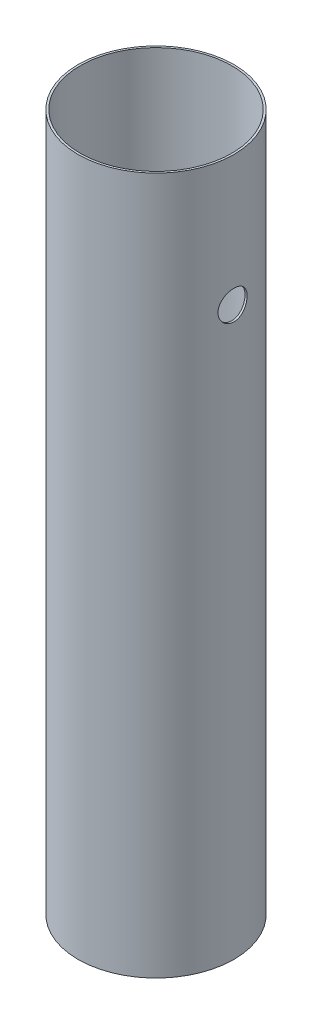
ISO-10303-21;
HEADER;
FILE_DESCRIPTION(('STEP AP214'),'2;1');
FILE_NAME('part.step','',(''),(''),'','','');
FILE_SCHEMA(('AUTOMOTIVE_DESIGN { 1 0 10303 214 1 1 1 1 }'));
ENDSEC;
DATA;
#1=APPLICATION_CONTEXT('core data for automotive mechanical design processes');
#2=APPLICATION_PROTOCOL_DEFINITION('international standard','automotive_design',2000,#1);
#3=PRODUCT_CONTEXT('',#1,'mechanical');
#4=PRODUCT('Part','Part','',(#3));
#5=PRODUCT_RELATED_PRODUCT_CATEGORY('part','',(#4));
#6=PRODUCT_DEFINITION_FORMATION('','',#4);
#7=PRODUCT_DEFINITION_CONTEXT('part definition',#1,'design');
#8=PRODUCT_DEFINITION('design','',#6,#7);
#9=PRODUCT_DEFINITION_SHAPE('','',#8);
#10=(LENGTH_UNIT() NAMED_UNIT(*) SI_UNIT(.MILLI.,.METRE.));
#11=(NAMED_UNIT(*) PLANE_ANGLE_UNIT() SI_UNIT($,.RADIAN.));
#12=(NAMED_UNIT(*) SI_UNIT($,.STERADIAN.) SOLID_ANGLE_UNIT());
#13=UNCERTAINTY_MEASURE_WITH_UNIT(LENGTH_MEASURE(1.E-05),#10,'distance_accuracy_value','');
#14=(GEOMETRIC_REPRESENTATION_CONTEXT(3) GLOBAL_UNCERTAINTY_ASSIGNED_CONTEXT((#13)) GLOBAL_UNIT_ASSIGNED_CONTEXT((#10,
#11,#12)) REPRESENTATION_CONTEXT('',''));
#15=CARTESIAN_POINT('',(0.,0.,0.));
#16=DIRECTION('',(0.,0.,1.));
#17=DIRECTION('',(1.,0.,0.));
#18=AXIS2_PLACEMENT_3D('',#15,#16,#17);
#19=CARTESIAN_POINT('',(0.,510.,0.));
#20=DIRECTION('',(0.,1.,0.));
#21=DIRECTION('',(0.,0.,1.));
#22=AXIS2_PLACEMENT_3D('',#19,#20,#21);
#23=PLANE('',#22);
#24=CARTESIAN_POINT('',(0.,510.,0.));
#25=DIRECTION('',(0.,1.,0.));
#26=DIRECTION('',(0.,0.,1.));
#27=AXIS2_PLACEMENT_3D('',#24,#25,#26);
#28=CIRCLE('',#27,57.);
#29=CARTESIAN_POINT('',(0.,510.,57.));
#30=VERTEX_POINT('',#29);
#31=EDGE_CURVE('E10',#30,#30,#28,.T.);
#32=ORIENTED_EDGE('',*,*,#31,.T.);
#33=EDGE_LOOP('',(#32));
#34=FACE_BOUND('',#33,.T.);
#35=CARTESIAN_POINT('',(0.,510.,0.));
#36=DIRECTION('',(0.,1.,0.));
#37=DIRECTION('',(0.,0.,1.));
#38=AXIS2_PLACEMENT_3D('',#35,#36,#37);
#39=CIRCLE('',#38,55.5);
#40=CARTESIAN_POINT('',(0.,510.,55.5));
#41=VERTEX_POINT('',#40);
#42=EDGE_CURVE('E62',#41,#41,#39,.T.);
#43=ORIENTED_EDGE('',*,*,#42,.F.);
#44=EDGE_LOOP('',(#43));
#45=FACE_BOUND('',#44,.T.);
#46=ADVANCED_FACE('F40',(#34,#45),#23,.T.);
#47=CARTESIAN_POINT('',(0.,0.,0.));
#48=DIRECTION('',(0.,1.,0.));
#49=DIRECTION('',(0.,0.,1.));
#50=AXIS2_PLACEMENT_3D('',#47,#48,#49);
#51=PLANE('',#50);
#52=CARTESIAN_POINT('',(0.,0.,0.));
#53=DIRECTION('',(0.,1.,0.));
#54=DIRECTION('',(0.,0.,1.));
#55=AXIS2_PLACEMENT_3D('',#52,#53,#54);
#56=CIRCLE('',#55,57.);
#57=CARTESIAN_POINT('',(0.,0.,57.));
#58=VERTEX_POINT('',#57);
#59=EDGE_CURVE('E55',#58,#58,#56,.T.);
#60=ORIENTED_EDGE('',*,*,#59,.F.);
#61=EDGE_LOOP('',(#60));
#62=FACE_BOUND('',#61,.T.);
#63=CARTESIAN_POINT('',(0.,0.,0.));
#64=DIRECTION('',(0.,1.,0.));
#65=DIRECTION('',(0.,0.,1.));
#66=AXIS2_PLACEMENT_3D('',#63,#64,#65);
#67=CIRCLE('',#66,55.5);
#68=CARTESIAN_POINT('',(0.,0.,55.5));
#69=VERTEX_POINT('',#68);
#70=EDGE_CURVE('E64',#69,#69,#67,.T.);
#71=ORIENTED_EDGE('',*,*,#70,.T.);
#72=EDGE_LOOP('',(#71));
#73=FACE_BOUND('',#72,.T.);
#74=ADVANCED_FACE('F88',(#62,#73),#51,.F.);
#75=CARTESIAN_POINT('',(0.,510.,0.));
#76=DIRECTION('',(0.,-1.,0.));
#77=DIRECTION('',(0.,0.,-1.));
#78=AXIS2_PLACEMENT_3D('',#75,#76,#77);
#79=CYLINDRICAL_SURFACE('',#78,57.);
#80=CARTESIAN_POINT('',(55.9962275515056,414.6,-10.65));
#81=CARTESIAN_POINT('',(55.9962248264401,414.303606493025,-10.65000534172));
#82=CARTESIAN_POINT('',(55.9985852715017,414.007281897164,-10.6376233888147));
#83=CARTESIAN_POINT('',(56.0079516401063,413.41668012737,-10.5882026044158));
#84=CARTESIAN_POINT('',(56.0149584054538,413.122403334216,-10.5511593048583));
#85=CARTESIAN_POINT('',(56.0334218056581,412.537892153058,-10.4526615865703));
#86=CARTESIAN_POINT('',(56.0448817409927,412.247660929092,-10.391189061291));
#87=CARTESIAN_POINT('',(56.0719147438818,411.673508328465,-10.2443130162571));
#88=CARTESIAN_POINT('',(56.0874878903964,411.389587073047,-10.1589090370958));
#89=CARTESIAN_POINT('',(56.1222786392683,410.830319468631,-9.96491503754015));
#90=CARTESIAN_POINT('',(56.1414927351434,410.554965163694,-9.85634731284519));
#91=CARTESIAN_POINT('',(56.1830247836914,410.014436025271,-9.61678197248011));
#92=CARTESIAN_POINT('',(56.2053427672397,409.749261293076,-9.48578413368787));
#93=CARTESIAN_POINT('',(56.2524446506903,409.230956376279,-9.20234175201339));
#94=CARTESIAN_POINT('',(56.2772279020502,408.97782304969,-9.04990284532547));
#95=CARTESIAN_POINT('',(56.3285806948245,408.485136021507,-8.72456958696255));
#96=CARTESIAN_POINT('',(56.3551508213267,408.24558681564,-8.55166852101495));
#97=CARTESIAN_POINT('',(56.4096306419738,407.779211287328,-8.18464126726331));
#98=CARTESIAN_POINT('',(56.4375517943655,407.552552430109,-7.99030395204357));
#99=CARTESIAN_POINT('',(56.4936771532857,407.116361181873,-7.58331246752891));
#100=CARTESIAN_POINT('',(56.5218813614878,406.906828892189,-7.37065818987174));
#101=CARTESIAN_POINT('',(56.5777924796539,406.506270753371,-6.92842489974231));
#102=CARTESIAN_POINT('',(56.6054992681262,406.315249376634,-6.69884182060156));
#103=CARTESIAN_POINT('',(56.6596274198989,405.953155198058,-6.22443471302231));
#104=CARTESIAN_POINT('',(56.6860492301467,405.78207543069,-5.97961605242516));
#105=CARTESIAN_POINT('',(56.7370797671978,405.459745562584,-5.47437068115217));
#106=CARTESIAN_POINT('',(56.7616728271243,405.308659705702,-5.21383756098572));
#107=CARTESIAN_POINT('',(56.8081197480287,405.029002539847,-4.68071722621854));
#108=CARTESIAN_POINT('',(56.8299735908356,404.900431380228,-4.40812993167054));
#109=CARTESIAN_POINT('',(56.8703180635001,404.666781700963,-3.85284324356493));
#110=CARTESIAN_POINT('',(56.8888089057385,404.561701697702,-3.57014448991842));
#111=CARTESIAN_POINT('',(56.9218990297129,404.375839399979,-2.99664766697977));
#112=CARTESIAN_POINT('',(56.9364983608684,404.295056796954,-2.70584970059393));
#113=CARTESIAN_POINT('',(56.9612413977656,404.159217796235,-2.12166409383837));
#114=CARTESIAN_POINT('',(56.9714345793777,404.103875263511,-1.82834506923622));
#115=CARTESIAN_POINT('',(56.987319660378,404.017992279439,-1.23797717786891));
#116=CARTESIAN_POINT('',(56.9930115909398,403.987451656324,-0.940928336949192));
#117=CARTESIAN_POINT('',(56.9997322826956,403.951418179998,-0.345284772764389));
#118=CARTESIAN_POINT('',(57.0007613901651,403.945923466802,-0.0466901659414234));
#119=CARTESIAN_POINT('',(56.998128059134,403.960021126265,0.549884290004525));
#120=CARTESIAN_POINT('',(56.9944656524013,403.979613329051,0.84786414327654));
#121=CARTESIAN_POINT('',(56.9826279514622,404.043326754974,1.43733760900372));
#122=CARTESIAN_POINT('',(56.9745094418128,404.087139384211,1.72886578114958));
#123=CARTESIAN_POINT('',(56.9540236082853,404.198735175137,2.30714178236026));
#124=CARTESIAN_POINT('',(56.9416563255379,404.266518104779,2.59388965767293));
#125=CARTESIAN_POINT('',(56.9130129842769,404.425538955788,3.16061087613501));
#126=CARTESIAN_POINT('',(56.8967368322076,404.516777438549,3.44058405696083));
#127=CARTESIAN_POINT('',(56.8607214322822,404.72202743699,3.99182397834183));
#128=CARTESIAN_POINT('',(56.8409821547105,404.836039148079,4.26309064416641));
#129=CARTESIAN_POINT('',(56.7984590685419,405.086704773344,4.79656722953723));
#130=CARTESIAN_POINT('',(56.775658843734,405.22348180146,5.05871798494014));
#131=CARTESIAN_POINT('',(56.7277239578587,405.518243430716,5.57058550096844));
#132=CARTESIAN_POINT('',(56.7025892916126,405.676228078903,5.82030223400811));
#133=CARTESIAN_POINT('',(56.6506690416864,406.012313538561,6.3056544423744));
#134=CARTESIAN_POINT('',(56.6238833357441,406.190415840594,6.5412888723318));
#135=CARTESIAN_POINT('',(56.5693912339517,406.565515082582,6.99690126508525));
#136=CARTESIAN_POINT('',(56.5416848084049,406.76251263237,7.21687872216401));
#137=CARTESIAN_POINT('',(56.4856833172036,407.177213626338,7.64293505402246));
#138=CARTESIAN_POINT('',(56.4573857136243,407.395186754678,7.84875119040487));
#139=CARTESIAN_POINT('',(56.4014181148873,407.847750459719,8.24132023264223));
#140=CARTESIAN_POINT('',(56.3737481264316,408.08234121376,8.42807293500374));
#141=CARTESIAN_POINT('',(56.3198205113734,408.5665467994,8.78121490307759));
#142=CARTESIAN_POINT('',(56.2935629321329,408.816162134222,8.94760348616328));
#143=CARTESIAN_POINT('',(56.2432144533586,409.328691358513,9.25881669197844));
#144=CARTESIAN_POINT('',(56.219123486505,409.591604834393,9.40364198480269));
#145=CARTESIAN_POINT('',(56.173766744464,410.129377567046,9.67090193171305));
#146=CARTESIAN_POINT('',(56.1525058674825,410.404256469719,9.79329790042524));
#147=CARTESIAN_POINT('',(56.113483733433,410.963603269106,10.0144677214029));
#148=CARTESIAN_POINT('',(56.0957224863652,411.248071193217,10.1132415061677));
#149=CARTESIAN_POINT('',(56.0642303486975,411.824529687584,10.2863903541128));
#150=CARTESIAN_POINT('',(56.050499086962,412.11651956242,10.3607676641251));
#151=CARTESIAN_POINT('',(56.0274784581005,412.705918263447,10.4845423458436));
#152=CARTESIAN_POINT('',(56.0181890292367,413.003327014261,10.5339400647458));
#153=CARTESIAN_POINT('',(56.0044375239406,413.596888408877,10.6068059116575));
#154=CARTESIAN_POINT('',(55.999905239643,413.892993166392,10.6306512654689));
#155=CARTESIAN_POINT('',(55.9955577723866,414.486193044688,10.6535274765912));
#156=CARTESIAN_POINT('',(55.9957425426067,414.783288155611,10.6525585802065));
#157=CARTESIAN_POINT('',(56.0008235567523,415.3763044913,10.6258149937319));
#158=CARTESIAN_POINT('',(56.0057195829299,415.672225769686,10.6000414500792));
#159=CARTESIAN_POINT('',(56.0200778127929,416.260772976048,10.5238956321937));
#160=CARTESIAN_POINT('',(56.0295400085615,416.553398909737,10.4735234006105));
#161=CARTESIAN_POINT('',(56.0526562910639,417.130877267135,10.3490910621219));
#162=CARTESIAN_POINT('',(56.0662752984392,417.415773805014,10.2752289753927));
#163=CARTESIAN_POINT('',(56.0973390453684,417.978286467881,10.1042611393219));
#164=CARTESIAN_POINT('',(56.1147837574901,418.255902645056,10.0071555566471));
#165=CARTESIAN_POINT('',(56.1530009963545,418.801927404991,9.79043285472258));
#166=CARTESIAN_POINT('',(56.1737731420239,419.070337037858,9.6708183130312));
#167=CARTESIAN_POINT('',(56.2180710819258,419.596269960854,9.40988796174031));
#168=CARTESIAN_POINT('',(56.2415978450811,419.853789376787,9.2685645106555));
#169=CARTESIAN_POINT('',(56.2910237307714,420.358972625446,8.96352489341094));
#170=CARTESIAN_POINT('',(56.3169466380936,420.606492366986,8.7995739306314));
#171=CARTESIAN_POINT('',(56.3702070439594,421.086890079312,8.4516693593635));
#172=CARTESIAN_POINT('',(56.3975445595271,421.319767873812,8.26771551011871));
#173=CARTESIAN_POINT('',(56.4528803704564,421.769379210708,7.88101797798321));
#174=CARTESIAN_POINT('',(56.4808788282609,421.986108728705,7.67826963928181));
#175=CARTESIAN_POINT('',(56.5367464531471,422.401834655451,7.25546317501655));
#176=CARTESIAN_POINT('',(56.5646156607552,422.600837037168,7.03541092722916));
#177=CARTESIAN_POINT('',(56.6198370741546,422.982396696598,6.57633650901651));
#178=CARTESIAN_POINT('',(56.64717727456,423.164696613804,6.3370988970832));
#179=CARTESIAN_POINT('',(56.7001755413523,423.508494004243,5.843935936847));
#180=CARTESIAN_POINT('',(56.7258335908211,423.669991268272,5.59001044087047));
#181=CARTESIAN_POINT('',(56.7747411937357,423.971008604837,5.06923548370909));
#182=CARTESIAN_POINT('',(56.7979908083739,424.110529235792,4.80238635113515));
#183=CARTESIAN_POINT('',(56.8414220164264,424.366559423154,4.25762760223069));
#184=CARTESIAN_POINT('',(56.8616036373567,424.483069185941,3.97971808512589));
#185=CARTESIAN_POINT('',(56.8982270917645,424.691642019261,3.41628859071298));
#186=CARTESIAN_POINT('',(56.9146879119121,424.783829624879,3.13081595697334));
#187=CARTESIAN_POINT('',(56.9435360707327,424.943838739597,2.55291798455564));
#188=CARTESIAN_POINT('',(56.9559234174867,425.011660297035,2.26049265967163));
#189=CARTESIAN_POINT('',(56.9762697993717,425.122394522179,1.67083648290181));
#190=CARTESIAN_POINT('',(56.9842292218752,425.165309368837,1.37360605372769));
#191=CARTESIAN_POINT('',(56.9954929129057,425.225893001999,0.776496752723851));
#192=CARTESIAN_POINT('',(56.9987972350358,425.243562079205,0.476617911430355));
#193=CARTESIAN_POINT('',(57.0006419456707,425.253436151318,-0.119004808087048));
#194=CARTESIAN_POINT('',(56.9992540516032,425.246024487186,-0.414742179900776));
#195=CARTESIAN_POINT('',(56.9919109713155,425.20663895254,-1.00451703453303));
#196=CARTESIAN_POINT('',(56.9859558346374,425.174665348456,-1.29855453575561));
#197=CARTESIAN_POINT('',(56.969644309272,425.086407847001,-1.88282815983226));
#198=CARTESIAN_POINT('',(56.9592879827422,425.030124292958,-2.17306433631247));
#199=CARTESIAN_POINT('',(56.9344615679833,424.893682951929,-2.74768898780213));
#200=CARTESIAN_POINT('',(56.9199914651625,424.813525080261,-3.03207744206591));
#201=CARTESIAN_POINT('',(56.8873660041778,424.630106367807,-3.59252715435197));
#202=CARTESIAN_POINT('',(56.8692171769252,424.526886436789,-3.86860218739492));
#203=CARTESIAN_POINT('',(56.8297153275996,424.298027643743,-4.41105646086681));
#204=CARTESIAN_POINT('',(56.8083623145245,424.17238884467,-4.67743572852071));
#205=CARTESIAN_POINT('',(56.7630369801119,423.899620524652,-5.19865977359342));
#206=CARTESIAN_POINT('',(56.739065107863,423.752494686907,-5.45350651807218));
#207=CARTESIAN_POINT('',(56.6891369974426,423.437697997916,-5.95013181284831));
#208=CARTESIAN_POINT('',(56.6631798692796,423.270017911645,-6.19190441810832));
#209=CARTESIAN_POINT('',(56.6096134914309,422.912788736642,-6.66400067500543));
#210=CARTESIAN_POINT('',(56.5819859994848,422.722962617399,-6.89411267734324));
#211=CARTESIAN_POINT('',(56.5261999521916,422.324804710958,-7.33748142591771));
#212=CARTESIAN_POINT('',(56.49804162109,422.11648060585,-7.5507451002605));
#213=CARTESIAN_POINT('',(56.441953535108,421.68257778405,-7.95917089387463));
#214=CARTESIAN_POINT('',(56.4140238883148,421.456991376856,-8.15432485843818));
#215=CARTESIAN_POINT('',(56.3591882687725,420.990173611417,-8.52508219857275));
#216=CARTESIAN_POINT('',(56.3322822874597,420.748942384099,-8.70068573772319));
#217=CARTESIAN_POINT('',(56.2800132135822,420.250172110759,-9.03264177312722));
#218=CARTESIAN_POINT('',(56.2546666279966,419.992503246424,-9.18880190974312));
#219=CARTESIAN_POINT('',(56.2065262150289,419.464684265688,-9.47881990829339));
#220=CARTESIAN_POINT('',(56.1837323457797,419.194534354092,-9.61267813601956));
#221=CARTESIAN_POINT('',(56.1413845881468,418.643862160338,-9.85699329812439));
#222=CARTESIAN_POINT('',(56.1218280428395,418.363348617412,-9.96746944350677));
#223=CARTESIAN_POINT('',(56.0865162377999,417.793843788029,-10.1642834314573));
#224=CARTESIAN_POINT('',(56.0707602084453,417.504854231322,-10.250626161718));
#225=CARTESIAN_POINT('',(56.0372851337831,416.786456271725,-10.4323984888836));
#226=CARTESIAN_POINT('',(56.0219693670987,416.353328657513,-10.513893475836));
#227=CARTESIAN_POINT('',(56.0014427343131,415.480083289658,-10.6226895383928));
#228=CARTESIAN_POINT('',(55.9962315965856,415.039965724236,-10.6499920707652));
#229=CARTESIAN_POINT('',(55.9962275515056,414.6,-10.65));
#230=B_SPLINE_CURVE_WITH_KNOTS('',3,(#80,#81,#82,#83,#84,#85,#86,#87,#88,#89,#90,#91,#92,#93,
#94,#95,#96,#97,#98,#99,#100,#101,#102,#103,#104,#105,#106,#107,#108,#109,#110,#111,#112,#113,
#114,#115,#116,#117,#118,#119,#120,#121,#122,#123,#124,#125,#126,#127,#128,#129,#130,#131,#132,
#133,#134,#135,#136,#137,#138,#139,#140,#141,#142,#143,#144,#145,#146,#147,#148,#149,#150,#151,
#152,#153,#154,#155,#156,#157,#158,#159,#160,#161,#162,#163,#164,#165,#166,#167,#168,#169,#170,
#171,#172,#173,#174,#175,#176,#177,#178,#179,#180,#181,#182,#183,#184,#185,#186,#187,#188,#189,
#190,#191,#192,#193,#194,#195,#196,#197,#198,#199,#200,#201,#202,#203,#204,#205,#206,#207,#208,
#209,#210,#211,#212,#213,#214,#215,#216,#217,#218,#219,#220,#221,#222,#223,#224,#225,#226,#227,
#228,#229),.UNSPECIFIED.,.T.,.F.,(4,2,2,2,2,2,2,2,2,2,2,2,2,2,2,2,2,2,2,2,2,2,2,2,2,2,2,2,2,2,2,
2,2,2,2,2,2,2,2,2,2,2,2,2,2,2,2,2,2,2,2,2,2,2,2,2,2,2,2,2,2,2,2,2,2,2,2,2,2,2,2,2,2,2,4),(0.,
0.888794156302915,1.7777493853298,2.66736472620574,3.55699714599681,4.44577710395667,
5.3345659035113,6.22312150308232,7.11196947810085,8.01052198767645,8.90907981340901,
9.80785420004703,10.7063137013963,11.6117477909776,12.5171878865973,13.4225707818129,
14.327942178734,15.2228651128496,16.1177818490925,17.0126321249878,17.9074763415635,
18.7911736398098,19.6748623836009,20.5585722799012,21.4422897593175,22.3309516314113,
23.2196154749738,24.1083452048378,24.9971036274913,25.8993995054322,26.8017050139616,
27.7040407604391,28.606348460328,29.5101980772732,30.4140502769482,31.3178192115339,
32.2215755841168,33.1117979223397,34.0020114242812,34.892183783733,35.7823545997926,
36.6652117603229,37.5480625905352,38.4308123846983,39.3138736197729,40.2069044567525,
41.0999460435165,41.9932094506551,42.8861707347928,43.7911494686404,44.6961373028276,
45.6011021378468,46.5060588560085,47.4062878801824,48.306515118463,49.2066635888626,
50.1068016940546,50.9932443686918,51.8796774280001,52.7660979686999,53.6525216535668,
54.5373852234342,55.4222463084804,56.3069558927312,57.192064444127,58.0897571489467,
58.9870787761893,59.8848025216538,60.7825187552529,61.6885094274872,62.5944852383668,
63.4997137738185,64.4047588420724,65.724117962855,67.0434416169591),.UNSPECIFIED.);
#231=CARTESIAN_POINT('',(55.9962275515056,414.6,-10.65));
#232=VERTEX_POINT('',#231);
#233=EDGE_CURVE('E68',#232,#232,#230,.T.);
#234=ORIENTED_EDGE('',*,*,#233,.T.);
#235=EDGE_LOOP('',(#234));
#236=FACE_BOUND('',#235,.T.);
#237=ORIENTED_EDGE('',*,*,#31,.F.);
#238=EDGE_LOOP('',(#237));
#239=FACE_BOUND('',#238,.T.);
#240=ORIENTED_EDGE('',*,*,#59,.T.);
#241=EDGE_LOOP('',(#240));
#242=FACE_BOUND('',#241,.T.);
#243=ADVANCED_FACE('F42',(#236,#239,#242),#79,.T.);
#244=CARTESIAN_POINT('',(0.,510.,0.));
#245=DIRECTION('',(0.,-1.,0.));
#246=DIRECTION('',(0.,0.,-1.));
#247=AXIS2_PLACEMENT_3D('',#244,#245,#246);
#248=CYLINDRICAL_SURFACE('',#247,55.5);
#249=CARTESIAN_POINT('',(54.4685918672403,414.6,-10.65));
#250=CARTESIAN_POINT('',(54.468588959538,414.303761899161,-10.6500055550788));
#251=CARTESIAN_POINT('',(54.4710131380416,414.007594582228,-10.6376364635373));
#252=CARTESIAN_POINT('',(54.4806319571317,413.417308546338,-10.588268254093));
#253=CARTESIAN_POINT('',(54.487827440437,413.123190198551,-10.5512647852047));
#254=CARTESIAN_POINT('',(54.5067874817091,412.53900227014,-10.4528757100879));
#255=CARTESIAN_POINT('',(54.5185553484806,412.248935779476,-10.3914724462182));
#256=CARTESIAN_POINT('',(54.5463137618559,411.675111791692,-10.2447657276484));
#257=CARTESIAN_POINT('',(54.562304391158,411.391354418247,-10.1594618048777));
#258=CARTESIAN_POINT('',(54.598026092729,410.832417990919,-9.96570275789061));
#259=CARTESIAN_POINT('',(54.6177534691488,410.557230771208,-9.85727049563187));
#260=CARTESIAN_POINT('',(54.6603936040822,410.017027071928,-9.61801056121866));
#261=CARTESIAN_POINT('',(54.683306393257,409.752010690289,-9.48718267349274));
#262=CARTESIAN_POINT('',(54.731662724475,409.234005415878,-9.20411297506312));
#263=CARTESIAN_POINT('',(54.7571056216304,408.981013482421,-9.05187661699269));
#264=CARTESIAN_POINT('',(54.8098248637525,408.488587717997,-8.72698003953602));
#265=CARTESIAN_POINT('',(54.8371018096566,408.24915837871,-8.55431311172934));
#266=CARTESIAN_POINT('',(54.8930484270365,407.782854749784,-8.18767402451644));
#267=CARTESIAN_POINT('',(54.9217305252808,407.556156928304,-7.99347928675957));
#268=CARTESIAN_POINT('',(54.9793873112533,407.119873169872,-7.58677418649701));
#269=CARTESIAN_POINT('',(55.0083620008075,406.910287339782,-7.37426370962919));
#270=CARTESIAN_POINT('',(55.0658031147716,406.509604114069,-6.93231429758467));
#271=CARTESIAN_POINT('',(55.0942694140883,406.318511219019,-6.7028712654053));
#272=CARTESIAN_POINT('',(55.1498848285052,405.956254819325,-6.22873557032993));
#273=CARTESIAN_POINT('',(55.1770344016498,405.785084354909,-5.98404827905556));
#274=CARTESIAN_POINT('',(55.2294863243884,405.462483478368,-5.47894370553984));
#275=CARTESIAN_POINT('',(55.2547717111656,405.311226346276,-5.21841394102744));
#276=CARTESIAN_POINT('',(55.3025302085309,405.031228538766,-4.68527184949097));
#277=CARTESIAN_POINT('',(55.3250032994104,404.902488021143,-4.4126594378092));
#278=CARTESIAN_POINT('',(55.3664953129546,404.668506273804,-3.85729431251491));
#279=CARTESIAN_POINT('',(55.3855144656719,404.563263478892,-3.57454227576466));
#280=CARTESIAN_POINT('',(55.4195549707147,404.377086652416,-3.00091110769929));
#281=CARTESIAN_POINT('',(55.4345763766696,404.296152294754,-2.71003208546471));
#282=CARTESIAN_POINT('',(55.4600327599571,404.160069453408,-2.12584190625744));
#283=CARTESIAN_POINT('',(55.4705212705093,404.104619474588,-1.83260329765709));
#284=CARTESIAN_POINT('',(55.4868780962192,404.018509926873,-1.24238056773984));
#285=CARTESIAN_POINT('',(55.4927464450924,403.987850177072,-0.945396473771551));
#286=CARTESIAN_POINT('',(55.4996960201972,403.951569294468,-0.349870137147735));
#287=CARTESIAN_POINT('',(55.500777620296,403.945946206185,-0.0513280180047245));
#288=CARTESIAN_POINT('',(55.4981238966245,403.95977902422,0.545151910713208));
#289=CARTESIAN_POINT('',(55.494388607313,403.979234751131,0.843089724595898));
#290=CARTESIAN_POINT('',(55.4822876907486,404.04264723775,1.43228557929929));
#291=CARTESIAN_POINT('',(55.4739835325693,404.086278792532,1.72357995500923));
#292=CARTESIAN_POINT('',(55.453017342819,404.197470988837,2.3014016339673));
#293=CARTESIAN_POINT('',(55.4403553557467,404.265031386018,2.58792898586123));
#294=CARTESIAN_POINT('',(55.4110210743362,404.4235655317,3.15422597519842));
#295=CARTESIAN_POINT('',(55.3943486805979,404.514539860532,3.43399544495454));
#296=CARTESIAN_POINT('',(55.3574492529971,404.719219994576,3.98484910635751));
#297=CARTESIAN_POINT('',(55.3372221871383,404.832926004403,4.25593321979957));
#298=CARTESIAN_POINT('',(55.2936353313748,405.082970809105,4.78914097872582));
#299=CARTESIAN_POINT('',(55.2702578790786,405.219438321727,5.05120281022607));
#300=CARTESIAN_POINT('',(55.2211010985885,405.513553021447,5.56291944593527));
#301=CARTESIAN_POINT('',(55.1953217648491,405.671200257445,5.81257422149645));
#302=CARTESIAN_POINT('',(55.1420605952547,406.006586811795,6.29783675460185));
#303=CARTESIAN_POINT('',(55.1145786258403,406.184327707252,6.53344340732039));
#304=CARTESIAN_POINT('',(55.0586597359243,406.558684381495,6.98903968156164));
#305=CARTESIAN_POINT('',(55.0302227840239,406.75530078128,7.20902878885492));
#306=CARTESIAN_POINT('',(54.9727091792122,407.169390685878,7.63532945127865));
#307=CARTESIAN_POINT('',(54.9436295874479,407.387148453578,7.84136459057261));
#308=CARTESIAN_POINT('',(54.8861026645687,407.83930201352,8.23439086450795));
#309=CARTESIAN_POINT('',(54.8576553405658,408.073697992791,8.42138178501783));
#310=CARTESIAN_POINT('',(54.8021995411011,408.557540236087,8.77501980196848));
#311=CARTESIAN_POINT('',(54.7751911167525,408.806987034082,8.94166617599408));
#312=CARTESIAN_POINT('',(54.7233893011517,409.319209937069,9.25341245748289));
#313=CARTESIAN_POINT('',(54.6985958400239,409.581985621162,9.39851304474755));
#314=CARTESIAN_POINT('',(54.6518983332128,410.119563129706,9.6663610481591));
#315=CARTESIAN_POINT('',(54.6299998009536,410.394386611204,9.78906597592125));
#316=CARTESIAN_POINT('',(54.5897928976933,410.953663495093,10.0108553084364));
#317=CARTESIAN_POINT('',(54.5714845376912,411.238116926983,10.1099396408246));
#318=CARTESIAN_POINT('',(54.5390065711856,411.814585290822,10.28370471172));
#319=CARTESIAN_POINT('',(54.5248365609306,412.106599482087,10.3583878309767));
#320=CARTESIAN_POINT('',(54.501061234736,412.69608427412,10.4827640050467));
#321=CARTESIAN_POINT('',(54.4914558515981,412.993554794495,10.5324574277464));
#322=CARTESIAN_POINT('',(54.4772154088063,413.587029536083,10.605865213813));
#323=CARTESIAN_POINT('',(54.4725042967202,413.882982801536,10.6299772182898));
#324=CARTESIAN_POINT('',(54.4679265323629,414.475905301385,10.6534090436902));
#325=CARTESIAN_POINT('',(54.4680598294117,414.772874525119,10.6527291239759));
#326=CARTESIAN_POINT('',(54.4731667635946,415.365662415361,10.6265835625619));
#327=CARTESIAN_POINT('',(54.4781401643921,415.661481137338,10.601119131061));
#328=CARTESIAN_POINT('',(54.4927793244861,416.249845889805,10.525610520068));
#329=CARTESIAN_POINT('',(54.5024450749589,416.542391926449,10.4755663867962));
#330=CARTESIAN_POINT('',(54.5260796711548,417.119582357994,10.3518384477376));
#331=CARTESIAN_POINT('',(54.5400101905063,417.40427345324,10.2783649601904));
#332=CARTESIAN_POINT('',(54.5718007413863,417.966405993539,10.108216782836));
#333=CARTESIAN_POINT('',(54.5896607430192,418.243847493729,10.011542269543));
#334=CARTESIAN_POINT('',(54.628800453052,418.789559529949,9.79572241801049));
#335=CARTESIAN_POINT('',(54.650079779331,419.057831086694,9.67657959042191));
#336=CARTESIAN_POINT('',(54.6954701822503,419.583529853777,9.41663133922514));
#337=CARTESIAN_POINT('',(54.7195822560113,419.840953201988,9.27581828230585));
#338=CARTESIAN_POINT('',(54.7702631122516,420.346141400611,8.97175044070641));
#339=CARTESIAN_POINT('',(54.7968576808732,420.593755147587,8.80824888653048));
#340=CARTESIAN_POINT('',(54.8515094505198,421.074380822465,8.46124981587443));
#341=CARTESIAN_POINT('',(54.8795666701501,421.307392564544,8.27775204500574));
#342=CARTESIAN_POINT('',(54.9363710610076,421.757317300348,7.89196719707582));
#343=CARTESIAN_POINT('',(54.9651184047005,421.974226213283,7.6896753862606));
#344=CARTESIAN_POINT('',(55.0224929553654,422.390359263565,7.26777584463058));
#345=CARTESIAN_POINT('',(55.0511201996183,422.589589346432,7.04817398259015));
#346=CARTESIAN_POINT('',(55.1078798201787,422.97180707389,6.58981431822536));
#347=CARTESIAN_POINT('',(55.1359993452717,423.154523037953,6.35082827223732));
#348=CARTESIAN_POINT('',(55.1905228159235,423.499172621833,5.85812368178434));
#349=CARTESIAN_POINT('',(55.2169267432394,423.661106020676,5.60440498071358));
#350=CARTESIAN_POINT('',(55.2672717421711,423.963011729176,5.0839945786376));
#351=CARTESIAN_POINT('',(55.2912128783498,424.102984614583,4.81730321798449));
#352=CARTESIAN_POINT('',(55.3359532492771,424.359930155228,4.27280759382827));
#353=CARTESIAN_POINT('',(55.3567525135978,424.476903026949,3.99500343495245));
#354=CARTESIAN_POINT('',(55.3945128287704,424.686382653801,3.43178776366146));
#355=CARTESIAN_POINT('',(55.4114940993044,424.77901875609,3.1464257250507));
#356=CARTESIAN_POINT('',(55.4412792225196,424.939932316991,2.56869867084033));
#357=CARTESIAN_POINT('',(55.4540830836893,425.008209825099,2.27633366947208));
#358=CARTESIAN_POINT('',(55.4751464278617,425.119856497321,1.68675098842477));
#359=CARTESIAN_POINT('',(55.483406331062,425.163227964613,1.38953376006849));
#360=CARTESIAN_POINT('',(55.4951462782028,425.224720006987,0.792405916650281));
#361=CARTESIAN_POINT('',(55.4986263804522,425.242840890103,0.492495334489564));
#362=CARTESIAN_POINT('',(55.500690291755,425.253597822167,-0.102981188747228));
#363=CARTESIAN_POINT('',(55.4993517592695,425.246638075649,-0.398539637326616));
#364=CARTESIAN_POINT('',(55.4919880942462,425.20818543523,-0.987994719048525));
#365=CARTESIAN_POINT('',(55.4859630153066,425.176692821902,-1.2818913711577));
#366=CARTESIAN_POINT('',(55.4693941181117,425.089423967634,-1.86592110894093));
#367=CARTESIAN_POINT('',(55.4588503693731,425.033648100275,-2.15605425244342));
#368=CARTESIAN_POINT('',(55.4335365339085,424.898246967638,-2.73051170874714));
#369=CARTESIAN_POINT('',(55.418766431704,424.818621615012,-3.01483600027006));
#370=CARTESIAN_POINT('',(55.3854400156589,424.636307821767,-3.57514380516549));
#371=CARTESIAN_POINT('',(55.3668911514684,424.533664720026,-3.85114252142822));
#372=CARTESIAN_POINT('',(55.3264962455318,424.305989386454,-4.39349128352878));
#373=CARTESIAN_POINT('',(55.3046502137968,424.180957222601,-4.65984135865929));
#374=CARTESIAN_POINT('',(55.2582579235033,423.909428048065,-5.1810602427381));
#375=CARTESIAN_POINT('',(55.2337121166255,423.762934626561,-5.43593096219215));
#376=CARTESIAN_POINT('',(55.1825688172359,423.449424887408,-5.93266194806084));
#377=CARTESIAN_POINT('',(55.1559704042775,423.282399342434,-6.17451629407843));
#378=CARTESIAN_POINT('',(55.1010404243668,422.926376138529,-6.64701153357539));
#379=CARTESIAN_POINT('',(55.0726888988358,422.737087458559,-6.87743087365641));
#380=CARTESIAN_POINT('',(55.015418855142,422.339986228553,-7.32146102492333));
#381=CARTESIAN_POINT('',(54.9865005756149,422.132181349507,-7.53507872836131));
#382=CARTESIAN_POINT('',(54.9288760982576,421.699292580001,-7.94426139539367));
#383=CARTESIAN_POINT('',(54.9001700012076,421.47420099288,-8.13981823129329));
#384=CARTESIAN_POINT('',(54.8437861050035,421.008340248959,-8.51143091580863));
#385=CARTESIAN_POINT('',(54.8161082977903,420.767571215069,-8.6874869172803));
#386=CARTESIAN_POINT('',(54.7622985108841,420.269541786506,-9.02049897167617));
#387=CARTESIAN_POINT('',(54.7361843568844,420.012142796222,-9.17725073792754));
#388=CARTESIAN_POINT('',(54.6865602473562,419.484800279632,-9.46847164798365));
#389=CARTESIAN_POINT('',(54.663050248549,419.214856961909,-9.60294116211799));
#390=CARTESIAN_POINT('',(54.6193440281716,418.664526597525,-9.8484932611014));
#391=CARTESIAN_POINT('',(54.5991451347317,418.38414819781,-9.95959472331258));
#392=CARTESIAN_POINT('',(54.5626426142231,417.814844909134,-10.1576639237666));
#393=CARTESIAN_POINT('',(54.546338211659,417.525921734561,-10.2446364672684));
#394=CARTESIAN_POINT('',(54.5114930182533,416.80428666133,-10.428797653911));
#395=CARTESIAN_POINT('',(54.4954912041114,416.367704396848,-10.5116388266275));
#396=CARTESIAN_POINT('',(54.4740429618504,415.487361705515,-10.622235025394));
#397=CARTESIAN_POINT('',(54.4685962213767,415.043601491473,-10.6499916815521));
#398=CARTESIAN_POINT('',(54.4685918672403,414.6,-10.65));
#399=B_SPLINE_CURVE_WITH_KNOTS('',3,(#249,#250,#251,#252,#253,#254,#255,#256,#257,#258,#259,
#260,#261,#262,#263,#264,#265,#266,#267,#268,#269,#270,#271,#272,#273,#274,#275,#276,#277,#278,
#279,#280,#281,#282,#283,#284,#285,#286,#287,#288,#289,#290,#291,#292,#293,#294,#295,#296,#297,
#298,#299,#300,#301,#302,#303,#304,#305,#306,#307,#308,#309,#310,#311,#312,#313,#314,#315,#316,
#317,#318,#319,#320,#321,#322,#323,#324,#325,#326,#327,#328,#329,#330,#331,#332,#333,#334,#335,
#336,#337,#338,#339,#340,#341,#342,#343,#344,#345,#346,#347,#348,#349,#350,#351,#352,#353,#354,
#355,#356,#357,#358,#359,#360,#361,#362,#363,#364,#365,#366,#367,#368,#369,#370,#371,#372,#373,
#374,#375,#376,#377,#378,#379,#380,#381,#382,#383,#384,#385,#386,#387,#388,#389,#390,#391,#392,
#393,#394,#395,#396,#397,#398),.UNSPECIFIED.,.T.,.F.,(4,2,2,2,2,2,2,2,2,2,2,2,2,2,2,2,2,2,2,2,2,
2,2,2,2,2,2,2,2,2,2,2,2,2,2,2,2,2,2,2,2,2,2,2,2,2,2,2,2,2,2,2,2,2,2,2,2,2,2,2,2,2,2,2,2,2,2,2,2,
2,2,2,2,2,4),(0.,0.888324599500727,1.77680613876042,2.66593182865155,3.55507493239971,
4.44334317350203,5.33161996520463,6.21967092550823,7.10801429264322,8.0065942865201,
8.90517989147142,9.80398363566974,10.7024724402039,11.6083249516159,12.5141838109346,
13.4199823125493,14.3257686623549,15.2205442129273,16.1153132338467,17.0100123679451,
17.9047051016399,18.78764507333,19.6705760293959,20.5535288716681,21.436489662002,
22.3246243640807,23.2127611167583,24.1009676257699,24.9892033666662,25.8917047715878,
26.7942163230353,27.6967599124795,28.5992750192845,29.5034849460541,30.4076976429552,
31.3118220923086,32.2159332311844,33.1057750653842,33.9956075904537,34.8853966682181,
35.7751840728074,36.6571989186594,37.5392070543175,38.4211166910911,39.3033376935026,
40.1960411139541,41.0887558925573,41.9816961367096,42.8743349312034,43.779684446365,
44.6850435870119,45.5903789873545,46.4957058659458,47.3961189630896,48.2965302305764,
49.1968582194722,50.0971752251458,50.9830478936507,51.8689104308972,52.7547593402068,
53.6406114938734,54.5247338450372,55.4088535118363,56.292825486995,57.177196189714,
58.0747813884951,58.9719964445802,59.8696133149857,60.7672231489848,61.6736374702373,
62.5800367254309,63.4857009297199,64.3911846418696,65.7214449226247,67.0516658365941),.UNSPECIFIED.);
#400=CARTESIAN_POINT('',(54.4685918672403,414.6,-10.65));
#401=VERTEX_POINT('',#400);
#402=EDGE_CURVE('E45',#401,#401,#399,.T.);
#403=ORIENTED_EDGE('',*,*,#402,.F.);
#404=EDGE_LOOP('',(#403));
#405=FACE_BOUND('',#404,.T.);
#406=ORIENTED_EDGE('',*,*,#42,.T.);
#407=EDGE_LOOP('',(#406));
#408=FACE_BOUND('',#407,.T.);
#409=ORIENTED_EDGE('',*,*,#70,.F.);
#410=EDGE_LOOP('',(#409));
#411=FACE_BOUND('',#410,.T.);
#412=ADVANCED_FACE('F80',(#405,#408,#411),#248,.F.);
#413=CARTESIAN_POINT('',(47.,414.6,0.));
#414=DIRECTION('',(1.,0.,0.));
#415=DIRECTION('',(0.,0.,-1.));
#416=AXIS2_PLACEMENT_3D('',#413,#414,#415);
#417=CYLINDRICAL_SURFACE('',#416,10.65);
#418=ORIENTED_EDGE('',*,*,#402,.T.);
#419=EDGE_LOOP('',(#418));
#420=FACE_BOUND('',#419,.T.);
#421=ORIENTED_EDGE('',*,*,#233,.F.);
#422=EDGE_LOOP('',(#421));
#423=FACE_BOUND('',#422,.T.);
#424=ADVANCED_FACE('F77',(#420,#423),#417,.F.);
#425=CLOSED_SHELL('',(#46,#74,#243,#412,#424));
#426=MANIFOLD_SOLID_BREP('B2',#425);
#427=ADVANCED_BREP_SHAPE_REPRESENTATION('',(#18,#426),#14);
#428=SHAPE_DEFINITION_REPRESENTATION(#9,#427);
ENDSEC;
END-ISO-10303-21;
